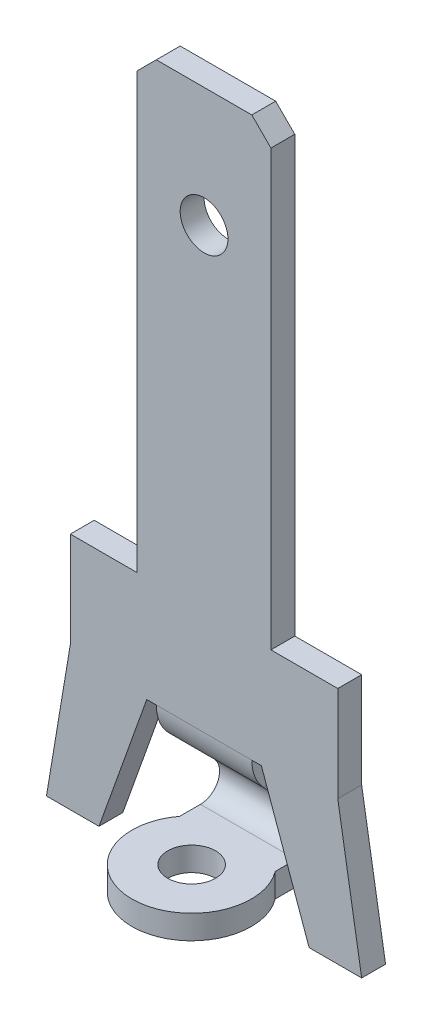
ISO-10303-21;
HEADER;
FILE_DESCRIPTION(('STEP AP214'),'2;1');
FILE_NAME('part.step','',(''),(''),'','','');
FILE_SCHEMA(('AUTOMOTIVE_DESIGN { 1 0 10303 214 1 1 1 1 }'));
ENDSEC;
DATA;
#1=APPLICATION_CONTEXT('core data for automotive mechanical design processes');
#2=APPLICATION_PROTOCOL_DEFINITION('international standard','automotive_design',2000,#1);
#3=PRODUCT_CONTEXT('',#1,'mechanical');
#4=PRODUCT('Part','Part','',(#3));
#5=PRODUCT_RELATED_PRODUCT_CATEGORY('part','',(#4));
#6=PRODUCT_DEFINITION_FORMATION('','',#4);
#7=PRODUCT_DEFINITION_CONTEXT('part definition',#1,'design');
#8=PRODUCT_DEFINITION('design','',#6,#7);
#9=PRODUCT_DEFINITION_SHAPE('','',#8);
#10=(LENGTH_UNIT() NAMED_UNIT(*) SI_UNIT(.MILLI.,.METRE.));
#11=(NAMED_UNIT(*) PLANE_ANGLE_UNIT() SI_UNIT($,.RADIAN.));
#12=(NAMED_UNIT(*) SI_UNIT($,.STERADIAN.) SOLID_ANGLE_UNIT());
#13=UNCERTAINTY_MEASURE_WITH_UNIT(LENGTH_MEASURE(1.E-05),#10,'distance_accuracy_value','');
#14=(GEOMETRIC_REPRESENTATION_CONTEXT(3) GLOBAL_UNCERTAINTY_ASSIGNED_CONTEXT((#13)) GLOBAL_UNIT_ASSIGNED_CONTEXT((#10,
#11,#12)) REPRESENTATION_CONTEXT('',''));
#15=CARTESIAN_POINT('',(0.,0.,0.));
#16=DIRECTION('',(0.,0.,1.));
#17=DIRECTION('',(1.,0.,0.));
#18=AXIS2_PLACEMENT_3D('',#15,#16,#17);
#19=CARTESIAN_POINT('',(1.2,-2.2,0.25));
#20=DIRECTION('',(0.,-1.,0.));
#21=DIRECTION('',(-1.,0.,0.));
#22=AXIS2_PLACEMENT_3D('',#19,#20,#21);
#23=PLANE('',#22);
#24=DIRECTION('',(-1.,0.,0.));
#25=VECTOR('',#24,1.);
#26=CARTESIAN_POINT('',(-1.4,-2.2,-0.25));
#27=LINE('',#26,#25);
#28=CARTESIAN_POINT('',(-1.,-2.2,-0.249999999999999));
#29=VERTEX_POINT('',#28);
#30=CARTESIAN_POINT('',(-1.2,-2.2,-0.25));
#31=VERTEX_POINT('',#30);
#32=EDGE_CURVE('E461',#29,#31,#27,.T.);
#33=ORIENTED_EDGE('',*,*,#32,.F.);
#34=DIRECTION('',(0.,0.,1.));
#35=VECTOR('',#34,1.);
#36=CARTESIAN_POINT('',(-1.,-2.2,-0.249999999999999));
#37=LINE('',#36,#35);
#38=CARTESIAN_POINT('',(-1.,-2.2,0.25));
#39=VERTEX_POINT('',#38);
#40=EDGE_CURVE('E375',#29,#39,#37,.T.);
#41=ORIENTED_EDGE('',*,*,#40,.T.);
#42=DIRECTION('',(-1.,0.,0.));
#43=VECTOR('',#42,1.);
#44=CARTESIAN_POINT('',(1.2,-2.2,0.25));
#45=LINE('',#44,#43);
#46=CARTESIAN_POINT('',(-1.2,-2.2,0.25));
#47=VERTEX_POINT('',#46);
#48=EDGE_CURVE('E410',#39,#47,#45,.T.);
#49=ORIENTED_EDGE('',*,*,#48,.T.);
#50=DIRECTION('',(0.,0.,1.));
#51=VECTOR('',#50,1.);
#52=CARTESIAN_POINT('',(-1.2,-2.2,0.25));
#53=LINE('',#52,#51);
#54=EDGE_CURVE('E489',#31,#47,#53,.T.);
#55=ORIENTED_EDGE('',*,*,#54,.F.);
#56=EDGE_LOOP('',(#33,#41,#49,#55));
#57=FACE_BOUND('',#56,.T.);
#58=ADVANCED_FACE('F84',(#57),#23,.T.);
#59=CARTESIAN_POINT('',(-2.8,0.,0.25));
#60=DIRECTION('',(1.,0.,0.));
#61=DIRECTION('',(0.,-1.,0.));
#62=AXIS2_PLACEMENT_3D('',#59,#60,#61);
#63=PLANE('',#62);
#64=DIRECTION('',(0.,0.,1.));
#65=VECTOR('',#64,1.);
#66=CARTESIAN_POINT('',(-2.8,0.,0.25));
#67=LINE('',#66,#65);
#68=CARTESIAN_POINT('',(-2.8,0.,-0.25));
#69=VERTEX_POINT('',#68);
#70=CARTESIAN_POINT('',(-2.8,0.,0.25));
#71=VERTEX_POINT('',#70);
#72=EDGE_CURVE('E498',#69,#71,#67,.T.);
#73=ORIENTED_EDGE('',*,*,#72,.F.);
#74=DIRECTION('',(0.,1.,0.));
#75=VECTOR('',#74,1.);
#76=CARTESIAN_POINT('',(-2.8,9.5,-0.25));
#77=LINE('',#76,#75);
#78=CARTESIAN_POINT('',(-2.8,-2.,-0.25));
#79=VERTEX_POINT('',#78);
#80=EDGE_CURVE('E471',#69,#79,#77,.F.);
#81=ORIENTED_EDGE('',*,*,#80,.T.);
#82=DIRECTION('',(0.,0.,1.));
#83=VECTOR('',#82,1.);
#84=CARTESIAN_POINT('',(-2.8,-2.,0.25));
#85=LINE('',#84,#83);
#86=CARTESIAN_POINT('',(-2.8,-2.,0.25));
#87=VERTEX_POINT('',#86);
#88=EDGE_CURVE('E496',#79,#87,#85,.T.);
#89=ORIENTED_EDGE('',*,*,#88,.T.);
#90=DIRECTION('',(0.,-1.,0.));
#91=VECTOR('',#90,1.);
#92=CARTESIAN_POINT('',(-2.8,0.,0.25));
#93=LINE('',#92,#91);
#94=EDGE_CURVE('E398',#71,#87,#93,.T.);
#95=ORIENTED_EDGE('',*,*,#94,.F.);
#96=EDGE_LOOP('',(#73,#81,#89,#95));
#97=FACE_BOUND('',#96,.T.);
#98=ADVANCED_FACE('F533',(#97),#63,.F.);
#99=CARTESIAN_POINT('',(-2.8,-2.,0.25));
#100=DIRECTION('',(0.986393923832144,-0.164398987305358,0.));
#101=DIRECTION('',(-0.164398987305358,-0.986393923832144,0.));
#102=AXIS2_PLACEMENT_3D('',#99,#100,#101);
#103=PLANE('',#102);
#104=ORIENTED_EDGE('',*,*,#88,.F.);
#105=DIRECTION('',(-0.164398987305358,-0.986393923832144,0.));
#106=VECTOR('',#105,1.);
#107=CARTESIAN_POINT('',(-2.8,-2.,-0.25));
#108=LINE('',#107,#106);
#109=CARTESIAN_POINT('',(-3.3,-5.,-0.25));
#110=VERTEX_POINT('',#109);
#111=EDGE_CURVE('E468',#79,#110,#108,.T.);
#112=ORIENTED_EDGE('',*,*,#111,.T.);
#113=DIRECTION('',(0.,0.,1.));
#114=VECTOR('',#113,1.);
#115=CARTESIAN_POINT('',(-3.3,-5.,0.25));
#116=LINE('',#115,#114);
#117=CARTESIAN_POINT('',(-3.3,-5.,0.25));
#118=VERTEX_POINT('',#117);
#119=EDGE_CURVE('E494',#110,#118,#116,.T.);
#120=ORIENTED_EDGE('',*,*,#119,.T.);
#121=DIRECTION('',(-0.164398987305358,-0.986393923832144,0.));
#122=VECTOR('',#121,1.);
#123=CARTESIAN_POINT('',(-2.8,-2.,0.25));
#124=LINE('',#123,#122);
#125=EDGE_CURVE('E401',#87,#118,#124,.T.);
#126=ORIENTED_EDGE('',*,*,#125,.F.);
#127=EDGE_LOOP('',(#104,#112,#120,#126));
#128=FACE_BOUND('',#127,.T.);
#129=ADVANCED_FACE('F537',(#128),#103,.F.);
#130=CARTESIAN_POINT('',(-3.3,-5.,0.25));
#131=DIRECTION('',(0.,1.,0.));
#132=DIRECTION('',(1.,0.,0.));
#133=AXIS2_PLACEMENT_3D('',#130,#131,#132);
#134=PLANE('',#133);
#135=ORIENTED_EDGE('',*,*,#119,.F.);
#136=DIRECTION('',(-1.,0.,0.));
#137=VECTOR('',#136,1.);
#138=CARTESIAN_POINT('',(-1.4,-5.,-0.25));
#139=LINE('',#138,#137);
#140=CARTESIAN_POINT('',(-2.2,-5.,-0.25));
#141=VERTEX_POINT('',#140);
#142=EDGE_CURVE('E465',#110,#141,#139,.F.);
#143=ORIENTED_EDGE('',*,*,#142,.T.);
#144=DIRECTION('',(0.,0.,1.));
#145=VECTOR('',#144,1.);
#146=CARTESIAN_POINT('',(-2.2,-5.,0.25));
#147=LINE('',#146,#145);
#148=CARTESIAN_POINT('',(-2.2,-5.,0.25));
#149=VERTEX_POINT('',#148);
#150=EDGE_CURVE('E492',#141,#149,#147,.T.);
#151=ORIENTED_EDGE('',*,*,#150,.T.);
#152=DIRECTION('',(1.,0.,0.));
#153=VECTOR('',#152,1.);
#154=CARTESIAN_POINT('',(-3.3,-5.,0.25));
#155=LINE('',#154,#153);
#156=EDGE_CURVE('E404',#118,#149,#155,.T.);
#157=ORIENTED_EDGE('',*,*,#156,.F.);
#158=EDGE_LOOP('',(#135,#143,#151,#157));
#159=FACE_BOUND('',#158,.T.);
#160=ADVANCED_FACE('F541',(#159),#134,.F.);
#161=CARTESIAN_POINT('',(-2.2,-5.,0.25));
#162=DIRECTION('',(-0.941741911594837,0.336336396998157,0.));
#163=DIRECTION('',(0.336336396998157,0.941741911594837,0.));
#164=AXIS2_PLACEMENT_3D('',#161,#162,#163);
#165=PLANE('',#164);
#166=ORIENTED_EDGE('',*,*,#150,.F.);
#167=DIRECTION('',(0.336336396998157,0.941741911594837,0.));
#168=VECTOR('',#167,1.);
#169=CARTESIAN_POINT('',(-2.2,-5.,-0.25));
#170=LINE('',#169,#168);
#171=EDGE_CURVE('E462',#141,#31,#170,.T.);
#172=ORIENTED_EDGE('',*,*,#171,.T.);
#173=ORIENTED_EDGE('',*,*,#54,.T.);
#174=DIRECTION('',(0.336336396998157,0.941741911594837,0.));
#175=VECTOR('',#174,1.);
#176=CARTESIAN_POINT('',(-2.2,-5.,0.25));
#177=LINE('',#176,#175);
#178=EDGE_CURVE('E407',#149,#47,#177,.T.);
#179=ORIENTED_EDGE('',*,*,#178,.F.);
#180=EDGE_LOOP('',(#166,#172,#173,#179));
#181=FACE_BOUND('',#180,.T.);
#182=ADVANCED_FACE('F546',(#181),#165,.F.);
#183=DIRECTION('',(0.,0.,1.));
#184=VECTOR('',#183,1.);
#185=CARTESIAN_POINT('',(1.,-2.2,-0.25));
#186=LINE('',#185,#184);
#187=CARTESIAN_POINT('',(1.,-2.2,-0.25));
#188=VERTEX_POINT('',#187);
#189=CARTESIAN_POINT('',(1.,-2.2,0.25));
#190=VERTEX_POINT('',#189);
#191=EDGE_CURVE('E384',#188,#190,#186,.T.);
#192=ORIENTED_EDGE('',*,*,#191,.F.);
#193=CARTESIAN_POINT('',(1.2,-2.2,-0.25));
#194=VERTEX_POINT('',#193);
#195=EDGE_CURVE('E458',#194,#188,#27,.T.);
#196=ORIENTED_EDGE('',*,*,#195,.F.);
#197=DIRECTION('',(0.,0.,1.));
#198=VECTOR('',#197,1.);
#199=CARTESIAN_POINT('',(1.2,-2.2,0.25));
#200=LINE('',#199,#198);
#201=CARTESIAN_POINT('',(1.2,-2.2,0.25));
#202=VERTEX_POINT('',#201);
#203=EDGE_CURVE('E487',#194,#202,#200,.T.);
#204=ORIENTED_EDGE('',*,*,#203,.T.);
#205=EDGE_CURVE('E411',#202,#190,#45,.T.);
#206=ORIENTED_EDGE('',*,*,#205,.T.);
#207=EDGE_LOOP('',(#192,#196,#204,#206));
#208=FACE_BOUND('',#207,.T.);
#209=ADVANCED_FACE('F558',(#208),#23,.T.);
#210=CARTESIAN_POINT('',(2.2,-5.,0.25));
#211=DIRECTION('',(-0.941741911594837,-0.336336396998157,0.));
#212=DIRECTION('',(-0.336336396998157,0.941741911594837,0.));
#213=AXIS2_PLACEMENT_3D('',#210,#211,#212);
#214=PLANE('',#213);
#215=ORIENTED_EDGE('',*,*,#203,.F.);
#216=DIRECTION('',(-0.336336396998157,0.941741911594837,0.));
#217=VECTOR('',#216,1.);
#218=CARTESIAN_POINT('',(2.2,-5.,-0.25));
#219=LINE('',#218,#217);
#220=CARTESIAN_POINT('',(2.2,-5.,-0.25));
#221=VERTEX_POINT('',#220);
#222=EDGE_CURVE('E455',#221,#194,#219,.T.);
#223=ORIENTED_EDGE('',*,*,#222,.F.);
#224=DIRECTION('',(0.,0.,1.));
#225=VECTOR('',#224,1.);
#226=CARTESIAN_POINT('',(2.2,-5.,0.25));
#227=LINE('',#226,#225);
#228=CARTESIAN_POINT('',(2.2,-5.,0.25));
#229=VERTEX_POINT('',#228);
#230=EDGE_CURVE('E485',#221,#229,#227,.T.);
#231=ORIENTED_EDGE('',*,*,#230,.T.);
#232=DIRECTION('',(-0.336336396998157,0.941741911594837,0.));
#233=VECTOR('',#232,1.);
#234=CARTESIAN_POINT('',(2.2,-5.,0.25));
#235=LINE('',#234,#233);
#236=EDGE_CURVE('E414',#229,#202,#235,.T.);
#237=ORIENTED_EDGE('',*,*,#236,.T.);
#238=EDGE_LOOP('',(#215,#223,#231,#237));
#239=FACE_BOUND('',#238,.T.);
#240=ADVANCED_FACE('F562',(#239),#214,.T.);
#241=CARTESIAN_POINT('',(3.3,-5.,0.25));
#242=DIRECTION('',(0.,-1.,0.));
#243=DIRECTION('',(-1.,0.,0.));
#244=AXIS2_PLACEMENT_3D('',#241,#242,#243);
#245=PLANE('',#244);
#246=ORIENTED_EDGE('',*,*,#230,.F.);
#247=DIRECTION('',(-1.,0.,0.));
#248=VECTOR('',#247,1.);
#249=CARTESIAN_POINT('',(-1.4,-5.,-0.25));
#250=LINE('',#249,#248);
#251=CARTESIAN_POINT('',(3.3,-5.,-0.25));
#252=VERTEX_POINT('',#251);
#253=EDGE_CURVE('E452',#252,#221,#250,.T.);
#254=ORIENTED_EDGE('',*,*,#253,.F.);
#255=DIRECTION('',(0.,0.,1.));
#256=VECTOR('',#255,1.);
#257=CARTESIAN_POINT('',(3.3,-5.,0.25));
#258=LINE('',#257,#256);
#259=CARTESIAN_POINT('',(3.3,-5.,0.25));
#260=VERTEX_POINT('',#259);
#261=EDGE_CURVE('E483',#252,#260,#258,.T.);
#262=ORIENTED_EDGE('',*,*,#261,.T.);
#263=DIRECTION('',(-1.,0.,0.));
#264=VECTOR('',#263,1.);
#265=CARTESIAN_POINT('',(3.3,-5.,0.25));
#266=LINE('',#265,#264);
#267=EDGE_CURVE('E417',#260,#229,#266,.T.);
#268=ORIENTED_EDGE('',*,*,#267,.T.);
#269=EDGE_LOOP('',(#246,#254,#262,#268));
#270=FACE_BOUND('',#269,.T.);
#271=ADVANCED_FACE('F566',(#270),#245,.T.);
#272=CARTESIAN_POINT('',(2.8,-2.,0.25));
#273=DIRECTION('',(0.986393923832144,0.164398987305358,0.));
#274=DIRECTION('',(0.164398987305358,-0.986393923832144,0.));
#275=AXIS2_PLACEMENT_3D('',#272,#273,#274);
#276=PLANE('',#275);
#277=ORIENTED_EDGE('',*,*,#261,.F.);
#278=DIRECTION('',(0.164398987305358,-0.986393923832144,0.));
#279=VECTOR('',#278,1.);
#280=CARTESIAN_POINT('',(2.8,-2.,-0.25));
#281=LINE('',#280,#279);
#282=CARTESIAN_POINT('',(2.8,-2.,-0.25));
#283=VERTEX_POINT('',#282);
#284=EDGE_CURVE('E449',#283,#252,#281,.T.);
#285=ORIENTED_EDGE('',*,*,#284,.F.);
#286=DIRECTION('',(0.,0.,1.));
#287=VECTOR('',#286,1.);
#288=CARTESIAN_POINT('',(2.8,-2.,0.25));
#289=LINE('',#288,#287);
#290=CARTESIAN_POINT('',(2.8,-2.,0.25));
#291=VERTEX_POINT('',#290);
#292=EDGE_CURVE('E481',#283,#291,#289,.T.);
#293=ORIENTED_EDGE('',*,*,#292,.T.);
#294=DIRECTION('',(0.164398987305358,-0.986393923832144,0.));
#295=VECTOR('',#294,1.);
#296=CARTESIAN_POINT('',(2.8,-2.,0.25));
#297=LINE('',#296,#295);
#298=EDGE_CURVE('E420',#291,#260,#297,.T.);
#299=ORIENTED_EDGE('',*,*,#298,.T.);
#300=EDGE_LOOP('',(#277,#285,#293,#299));
#301=FACE_BOUND('',#300,.T.);
#302=ADVANCED_FACE('F571',(#301),#276,.T.);
#303=CARTESIAN_POINT('',(2.8,0.,0.25));
#304=DIRECTION('',(1.,0.,0.));
#305=DIRECTION('',(0.,-1.,0.));
#306=AXIS2_PLACEMENT_3D('',#303,#304,#305);
#307=PLANE('',#306);
#308=ORIENTED_EDGE('',*,*,#292,.F.);
#309=DIRECTION('',(0.,1.,0.));
#310=VECTOR('',#309,1.);
#311=CARTESIAN_POINT('',(2.8,9.5,-0.25));
#312=LINE('',#311,#310);
#313=CARTESIAN_POINT('',(2.8,0.,-0.25));
#314=VERTEX_POINT('',#313);
#315=EDGE_CURVE('E446',#314,#283,#312,.F.);
#316=ORIENTED_EDGE('',*,*,#315,.F.);
#317=DIRECTION('',(0.,0.,1.));
#318=VECTOR('',#317,1.);
#319=CARTESIAN_POINT('',(2.8,0.,0.25));
#320=LINE('',#319,#318);
#321=CARTESIAN_POINT('',(2.8,0.,0.25));
#322=VERTEX_POINT('',#321);
#323=EDGE_CURVE('E479',#314,#322,#320,.T.);
#324=ORIENTED_EDGE('',*,*,#323,.T.);
#325=DIRECTION('',(0.,-1.,0.));
#326=VECTOR('',#325,1.);
#327=CARTESIAN_POINT('',(2.8,0.,0.25));
#328=LINE('',#327,#326);
#329=EDGE_CURVE('E423',#322,#291,#328,.T.);
#330=ORIENTED_EDGE('',*,*,#329,.T.);
#331=EDGE_LOOP('',(#308,#316,#324,#330));
#332=FACE_BOUND('',#331,.T.);
#333=ADVANCED_FACE('F574',(#332),#307,.T.);
#334=CARTESIAN_POINT('',(0.,0.,0.25));
#335=DIRECTION('',(0.,1.,0.));
#336=DIRECTION('',(1.,0.,0.));
#337=AXIS2_PLACEMENT_3D('',#334,#335,#336);
#338=PLANE('',#337);
#339=ORIENTED_EDGE('',*,*,#323,.F.);
#340=DIRECTION('',(-1.,0.,0.));
#341=VECTOR('',#340,1.);
#342=CARTESIAN_POINT('',(-1.4,0.,-0.25));
#343=LINE('',#342,#341);
#344=CARTESIAN_POINT('',(1.4,0.,-0.25));
#345=VERTEX_POINT('',#344);
#346=EDGE_CURVE('E443',#345,#314,#343,.F.);
#347=ORIENTED_EDGE('',*,*,#346,.F.);
#348=DIRECTION('',(0.,0.,1.));
#349=VECTOR('',#348,1.);
#350=CARTESIAN_POINT('',(1.4,0.,0.25));
#351=LINE('',#350,#349);
#352=CARTESIAN_POINT('',(1.4,0.,0.25));
#353=VERTEX_POINT('',#352);
#354=EDGE_CURVE('E476',#345,#353,#351,.T.);
#355=ORIENTED_EDGE('',*,*,#354,.T.);
#356=DIRECTION('',(1.,0.,0.));
#357=VECTOR('',#356,1.);
#358=CARTESIAN_POINT('',(0.,0.,0.25));
#359=LINE('',#358,#357);
#360=EDGE_CURVE('E426',#353,#322,#359,.T.);
#361=ORIENTED_EDGE('',*,*,#360,.T.);
#362=EDGE_LOOP('',(#339,#347,#355,#361));
#363=FACE_BOUND('',#362,.T.);
#364=ADVANCED_FACE('F578',(#363),#338,.T.);
#365=CARTESIAN_POINT('',(1.4,9.5,0.25));
#366=DIRECTION('',(1.,0.,0.));
#367=DIRECTION('',(0.,-1.,0.));
#368=AXIS2_PLACEMENT_3D('',#365,#366,#367);
#369=PLANE('',#368);
#370=DIRECTION('',(0.,1.,0.));
#371=VECTOR('',#370,1.);
#372=CARTESIAN_POINT('',(1.4,9.5,-0.25));
#373=LINE('',#372,#371);
#374=CARTESIAN_POINT('',(1.4,9.1,-0.25));
#375=VERTEX_POINT('',#374);
#376=EDGE_CURVE('E441',#375,#345,#373,.F.);
#377=ORIENTED_EDGE('',*,*,#376,.F.);
#378=DIRECTION('',(0.,0.,1.));
#379=VECTOR('',#378,1.);
#380=CARTESIAN_POINT('',(1.4,9.1,0.25));
#381=LINE('',#380,#379);
#382=CARTESIAN_POINT('',(1.4,9.1,0.25));
#383=VERTEX_POINT('',#382);
#384=EDGE_CURVE('E13',#375,#383,#381,.T.);
#385=ORIENTED_EDGE('',*,*,#384,.T.);
#386=DIRECTION('',(0.,-1.,0.));
#387=VECTOR('',#386,1.);
#388=CARTESIAN_POINT('',(1.4,9.5,0.25));
#389=LINE('',#388,#387);
#390=EDGE_CURVE('E429',#383,#353,#389,.T.);
#391=ORIENTED_EDGE('',*,*,#390,.T.);
#392=ORIENTED_EDGE('',*,*,#354,.F.);
#393=EDGE_LOOP('',(#377,#385,#391,#392));
#394=FACE_BOUND('',#393,.T.);
#395=ADVANCED_FACE('F582',(#394),#369,.T.);
#396=CARTESIAN_POINT('',(-1.4,9.5,0.25));
#397=DIRECTION('',(0.,1.,0.));
#398=DIRECTION('',(1.,0.,0.));
#399=AXIS2_PLACEMENT_3D('',#396,#397,#398);
#400=PLANE('',#399);
#401=DIRECTION('',(-1.,0.,0.));
#402=VECTOR('',#401,1.);
#403=CARTESIAN_POINT('',(-1.4,9.5,-0.25));
#404=LINE('',#403,#402);
#405=CARTESIAN_POINT('',(-1.,9.5,-0.25));
#406=VERTEX_POINT('',#405);
#407=CARTESIAN_POINT('',(0.999999999999997,9.5,-0.25));
#408=VERTEX_POINT('',#407);
#409=EDGE_CURVE('E393',#406,#408,#404,.F.);
#410=ORIENTED_EDGE('',*,*,#409,.F.);
#411=DIRECTION('',(0.,0.,1.));
#412=VECTOR('',#411,1.);
#413=CARTESIAN_POINT('',(-1.,9.5,0.25));
#414=LINE('',#413,#412);
#415=CARTESIAN_POINT('',(-1.,9.5,0.25));
#416=VERTEX_POINT('',#415);
#417=EDGE_CURVE('E504',#406,#416,#414,.T.);
#418=ORIENTED_EDGE('',*,*,#417,.T.);
#419=DIRECTION('',(1.,0.,0.));
#420=VECTOR('',#419,1.);
#421=CARTESIAN_POINT('',(-1.4,9.5,0.25));
#422=LINE('',#421,#420);
#423=CARTESIAN_POINT('',(0.999999999999997,9.5,0.25));
#424=VERTEX_POINT('',#423);
#425=EDGE_CURVE('E431',#416,#424,#422,.T.);
#426=ORIENTED_EDGE('',*,*,#425,.T.);
#427=DIRECTION('',(0.,0.,-1.));
#428=VECTOR('',#427,1.);
#429=CARTESIAN_POINT('',(0.999999999999997,9.5,0.25));
#430=LINE('',#429,#428);
#431=EDGE_CURVE('E500',#424,#408,#430,.T.);
#432=ORIENTED_EDGE('',*,*,#431,.T.);
#433=EDGE_LOOP('',(#410,#418,#426,#432));
#434=FACE_BOUND('',#433,.T.);
#435=ADVANCED_FACE('F519',(#434),#400,.T.);
#436=CARTESIAN_POINT('',(-1.4,9.5,0.25));
#437=DIRECTION('',(1.,0.,0.));
#438=DIRECTION('',(0.,-1.,0.));
#439=AXIS2_PLACEMENT_3D('',#436,#437,#438);
#440=PLANE('',#439);
#441=DIRECTION('',(0.,-1.,0.));
#442=VECTOR('',#441,1.);
#443=CARTESIAN_POINT('',(-1.4,9.5,0.25));
#444=LINE('',#443,#442);
#445=CARTESIAN_POINT('',(-1.4,9.1,0.25));
#446=VERTEX_POINT('',#445);
#447=CARTESIAN_POINT('',(-1.4,0.,0.25));
#448=VERTEX_POINT('',#447);
#449=EDGE_CURVE('E392',#446,#448,#444,.T.);
#450=ORIENTED_EDGE('',*,*,#449,.F.);
#451=DIRECTION('',(0.,0.,1.));
#452=VECTOR('',#451,1.);
#453=CARTESIAN_POINT('',(-1.4,9.1,0.25));
#454=LINE('',#453,#452);
#455=CARTESIAN_POINT('',(-1.4,9.1,-0.25));
#456=VERTEX_POINT('',#455);
#457=EDGE_CURVE('E107',#446,#456,#454,.F.);
#458=ORIENTED_EDGE('',*,*,#457,.T.);
#459=DIRECTION('',(0.,1.,0.));
#460=VECTOR('',#459,1.);
#461=CARTESIAN_POINT('',(-1.4,9.5,-0.25));
#462=LINE('',#461,#460);
#463=CARTESIAN_POINT('',(-1.4,0.,-0.25));
#464=VERTEX_POINT('',#463);
#465=EDGE_CURVE('E437',#456,#464,#462,.F.);
#466=ORIENTED_EDGE('',*,*,#465,.T.);
#467=DIRECTION('',(0.,0.,1.));
#468=VECTOR('',#467,1.);
#469=CARTESIAN_POINT('',(-1.4,0.,0.25));
#470=LINE('',#469,#468);
#471=EDGE_CURVE('E434',#464,#448,#470,.T.);
#472=ORIENTED_EDGE('',*,*,#471,.T.);
#473=EDGE_LOOP('',(#450,#458,#466,#472));
#474=FACE_BOUND('',#473,.T.);
#475=ADVANCED_FACE('F525',(#474),#440,.F.);
#476=CARTESIAN_POINT('',(0.,7.,0.25));
#477=DIRECTION('',(0.,0.,1.));
#478=DIRECTION('',(1.,0.,0.));
#479=AXIS2_PLACEMENT_3D('',#476,#477,#478);
#480=CYLINDRICAL_SURFACE('',#479,0.5);
#481=CARTESIAN_POINT('',(0.,7.,0.25));
#482=DIRECTION('',(0.,0.,1.));
#483=DIRECTION('',(1.,0.,0.));
#484=AXIS2_PLACEMENT_3D('',#481,#482,#483);
#485=CIRCLE('',#484,0.5);
#486=CARTESIAN_POINT('',(0.500000000000001,7.,0.25));
#487=VERTEX_POINT('',#486);
#488=EDGE_CURVE('E389',#487,#487,#485,.T.);
#489=ORIENTED_EDGE('',*,*,#488,.T.);
#490=EDGE_LOOP('',(#489));
#491=FACE_BOUND('',#490,.T.);
#492=CARTESIAN_POINT('',(0.,7.,-0.25));
#493=DIRECTION('',(0.,0.,1.));
#494=DIRECTION('',(1.,0.,0.));
#495=AXIS2_PLACEMENT_3D('',#492,#493,#494);
#496=CIRCLE('',#495,0.5);
#497=CARTESIAN_POINT('',(0.500000000000001,7.,-0.25));
#498=VERTEX_POINT('',#497);
#499=EDGE_CURVE('E386',#498,#498,#496,.T.);
#500=ORIENTED_EDGE('',*,*,#499,.F.);
#501=EDGE_LOOP('',(#500));
#502=FACE_BOUND('',#501,.T.);
#503=ADVANCED_FACE('F611',(#491,#502),#480,.F.);
#504=CARTESIAN_POINT('',(0.,0.,0.25));
#505=DIRECTION('',(0.,-1.,0.));
#506=DIRECTION('',(-1.,0.,0.));
#507=AXIS2_PLACEMENT_3D('',#504,#505,#506);
#508=PLANE('',#507);
#509=DIRECTION('',(-1.,0.,0.));
#510=VECTOR('',#509,1.);
#511=CARTESIAN_POINT('',(-1.4,0.,-0.25));
#512=LINE('',#511,#510);
#513=EDGE_CURVE('E439',#464,#69,#512,.T.);
#514=ORIENTED_EDGE('',*,*,#513,.T.);
#515=ORIENTED_EDGE('',*,*,#72,.T.);
#516=DIRECTION('',(-1.,0.,0.));
#517=VECTOR('',#516,1.);
#518=CARTESIAN_POINT('',(0.,0.,0.25));
#519=LINE('',#518,#517);
#520=EDGE_CURVE('E395',#448,#71,#519,.T.);
#521=ORIENTED_EDGE('',*,*,#520,.F.);
#522=ORIENTED_EDGE('',*,*,#471,.F.);
#523=EDGE_LOOP('',(#514,#515,#521,#522));
#524=FACE_BOUND('',#523,.T.);
#525=ADVANCED_FACE('F529',(#524),#508,.F.);
#526=CARTESIAN_POINT('',(-1.4,9.5,0.25));
#527=DIRECTION('',(0.,0.,-1.));
#528=DIRECTION('',(-1.,0.,0.));
#529=AXIS2_PLACEMENT_3D('',#526,#527,#528);
#530=PLANE('',#529);
#531=ORIENTED_EDGE('',*,*,#488,.F.);
#532=EDGE_LOOP('',(#531));
#533=FACE_BOUND('',#532,.T.);
#534=ORIENTED_EDGE('',*,*,#425,.F.);
#535=DIRECTION('',(-0.707106781186546,-0.707106781186549,0.));
#536=VECTOR('',#535,1.);
#537=CARTESIAN_POINT('',(-1.,9.5,0.25));
#538=LINE('',#537,#536);
#539=EDGE_CURVE('E509',#416,#446,#538,.T.);
#540=ORIENTED_EDGE('',*,*,#539,.T.);
#541=ORIENTED_EDGE('',*,*,#449,.T.);
#542=ORIENTED_EDGE('',*,*,#520,.T.);
#543=ORIENTED_EDGE('',*,*,#94,.T.);
#544=ORIENTED_EDGE('',*,*,#125,.T.);
#545=ORIENTED_EDGE('',*,*,#156,.T.);
#546=ORIENTED_EDGE('',*,*,#178,.T.);
#547=ORIENTED_EDGE('',*,*,#48,.F.);
#548=DIRECTION('',(-1.,0.,0.));
#549=VECTOR('',#548,1.);
#550=CARTESIAN_POINT('',(-1.,-2.2,0.250000000000001));
#551=LINE('',#550,#549);
#552=EDGE_CURVE('E368',#39,#190,#551,.F.);
#553=ORIENTED_EDGE('',*,*,#552,.T.);
#554=ORIENTED_EDGE('',*,*,#205,.F.);
#555=ORIENTED_EDGE('',*,*,#236,.F.);
#556=ORIENTED_EDGE('',*,*,#267,.F.);
#557=ORIENTED_EDGE('',*,*,#298,.F.);
#558=ORIENTED_EDGE('',*,*,#329,.F.);
#559=ORIENTED_EDGE('',*,*,#360,.F.);
#560=ORIENTED_EDGE('',*,*,#390,.F.);
#561=DIRECTION('',(0.707106781186551,-0.707106781186544,0.));
#562=VECTOR('',#561,1.);
#563=CARTESIAN_POINT('',(1.4,9.1,0.25));
#564=LINE('',#563,#562);
#565=EDGE_CURVE('E507',#383,#424,#564,.F.);
#566=ORIENTED_EDGE('',*,*,#565,.T.);
#567=EDGE_LOOP('',(#534,#540,#541,#542,#543,#544,#545,#546,#547,#553,#554,#555,#556,#557,#558,
#559,#560,#566));
#568=FACE_BOUND('',#567,.T.);
#569=ADVANCED_FACE('F524',(#533,#568),#530,.F.);
#570=CARTESIAN_POINT('',(-1.4,9.5,-0.25));
#571=DIRECTION('',(0.,0.,-1.));
#572=DIRECTION('',(-1.,0.,0.));
#573=AXIS2_PLACEMENT_3D('',#570,#571,#572);
#574=PLANE('',#573);
#575=ORIENTED_EDGE('',*,*,#499,.T.);
#576=EDGE_LOOP('',(#575));
#577=FACE_BOUND('',#576,.T.);
#578=ORIENTED_EDGE('',*,*,#465,.F.);
#579=DIRECTION('',(0.707106781186546,0.707106781186549,0.));
#580=VECTOR('',#579,1.);
#581=CARTESIAN_POINT('',(-1.2,9.3,-0.25));
#582=LINE('',#581,#580);
#583=EDGE_CURVE('E92',#456,#406,#582,.T.);
#584=ORIENTED_EDGE('',*,*,#583,.T.);
#585=ORIENTED_EDGE('',*,*,#409,.T.);
#586=DIRECTION('',(-0.707106781186551,0.707106781186544,0.));
#587=VECTOR('',#586,1.);
#588=CARTESIAN_POINT('',(-0.200000000000012,10.7,-0.25));
#589=LINE('',#588,#587);
#590=EDGE_CURVE('E99',#408,#375,#589,.F.);
#591=ORIENTED_EDGE('',*,*,#590,.T.);
#592=ORIENTED_EDGE('',*,*,#376,.T.);
#593=ORIENTED_EDGE('',*,*,#346,.T.);
#594=ORIENTED_EDGE('',*,*,#315,.T.);
#595=ORIENTED_EDGE('',*,*,#284,.T.);
#596=ORIENTED_EDGE('',*,*,#253,.T.);
#597=ORIENTED_EDGE('',*,*,#222,.T.);
#598=ORIENTED_EDGE('',*,*,#195,.T.);
#599=DIRECTION('',(-1.,0.,0.));
#600=VECTOR('',#599,1.);
#601=CARTESIAN_POINT('',(-1.,-2.2,-0.249999999999999));
#602=LINE('',#601,#600);
#603=EDGE_CURVE('E380',#29,#188,#602,.F.);
#604=ORIENTED_EDGE('',*,*,#603,.F.);
#605=ORIENTED_EDGE('',*,*,#32,.T.);
#606=ORIENTED_EDGE('',*,*,#171,.F.);
#607=ORIENTED_EDGE('',*,*,#142,.F.);
#608=ORIENTED_EDGE('',*,*,#111,.F.);
#609=ORIENTED_EDGE('',*,*,#80,.F.);
#610=ORIENTED_EDGE('',*,*,#513,.F.);
#611=EDGE_LOOP('',(#578,#584,#585,#591,#592,#593,#594,#595,#596,#597,#598,#604,#605,#606,#607,
#608,#609,#610));
#612=FACE_BOUND('',#611,.T.);
#613=ADVANCED_FACE('F514',(#577,#612),#574,.T.);
#614=CARTESIAN_POINT('',(1.,-2.2,-0.650000000000001));
#615=DIRECTION('',(1.,0.,0.));
#616=DIRECTION('',(0.,0.,-1.));
#617=AXIS2_PLACEMENT_3D('',#614,#615,#616);
#618=PLANE('',#617);
#619=DIRECTION('',(0.,-0.707106781186544,0.707106781186551));
#620=VECTOR('',#619,1.);
#621=CARTESIAN_POINT('',(1.,-2.83639610306789,-0.0136038969321037));
#622=LINE('',#621,#620);
#623=CARTESIAN_POINT('',(1.,-2.48284271247462,-0.36715728752538));
#624=VERTEX_POINT('',#623);
#625=CARTESIAN_POINT('',(1.,-2.83639610306789,-0.0136038969321038));
#626=VERTEX_POINT('',#625);
#627=EDGE_CURVE('E322',#624,#626,#622,.T.);
#628=ORIENTED_EDGE('',*,*,#627,.F.);
#629=CARTESIAN_POINT('',(1.,-2.2,-0.650000000000001));
#630=DIRECTION('',(-1.,0.,0.));
#631=DIRECTION('',(0.,0.,1.));
#632=AXIS2_PLACEMENT_3D('',#629,#630,#631);
#633=CIRCLE('',#632,0.400000000000001);
#634=EDGE_CURVE('E377',#188,#624,#633,.F.);
#635=ORIENTED_EDGE('',*,*,#634,.F.);
#636=ORIENTED_EDGE('',*,*,#191,.T.);
#637=CARTESIAN_POINT('',(1.,-2.2,-0.650000000000001));
#638=DIRECTION('',(-1.,0.,0.));
#639=DIRECTION('',(0.,0.,1.));
#640=AXIS2_PLACEMENT_3D('',#637,#638,#639);
#641=CIRCLE('',#640,0.900000000000001);
#642=EDGE_CURVE('E371',#190,#626,#641,.F.);
#643=ORIENTED_EDGE('',*,*,#642,.T.);
#644=EDGE_LOOP('',(#628,#635,#636,#643));
#645=FACE_BOUND('',#644,.T.);
#646=ADVANCED_FACE('F686',(#645),#618,.T.);
#647=CARTESIAN_POINT('',(-1.,-2.2,-0.65));
#648=DIRECTION('',(1.,0.,0.));
#649=DIRECTION('',(0.,0.,-1.));
#650=AXIS2_PLACEMENT_3D('',#647,#648,#649);
#651=PLANE('',#650);
#652=CARTESIAN_POINT('',(-1.,-2.2,-0.65));
#653=DIRECTION('',(-1.,0.,0.));
#654=DIRECTION('',(0.,0.,1.));
#655=AXIS2_PLACEMENT_3D('',#652,#653,#654);
#656=CIRCLE('',#655,0.400000000000001);
#657=CARTESIAN_POINT('',(-1.,-2.48284271247462,-0.367157287525379));
#658=VERTEX_POINT('',#657);
#659=EDGE_CURVE('E337',#658,#29,#656,.T.);
#660=ORIENTED_EDGE('',*,*,#659,.F.);
#661=DIRECTION('',(0.,-0.707106781186544,0.707106781186551));
#662=VECTOR('',#661,1.);
#663=CARTESIAN_POINT('',(-1.,-2.48284271247462,-0.36715728752538));
#664=LINE('',#663,#662);
#665=CARTESIAN_POINT('',(-1.,-2.83639610306789,-0.0136038969321037));
#666=VERTEX_POINT('',#665);
#667=EDGE_CURVE('E361',#658,#666,#664,.T.);
#668=ORIENTED_EDGE('',*,*,#667,.T.);
#669=CARTESIAN_POINT('',(-1.,-2.2,-0.65));
#670=DIRECTION('',(-1.,0.,0.));
#671=DIRECTION('',(0.,0.,1.));
#672=AXIS2_PLACEMENT_3D('',#669,#670,#671);
#673=CIRCLE('',#672,0.900000000000001);
#674=EDGE_CURVE('E372',#666,#39,#673,.T.);
#675=ORIENTED_EDGE('',*,*,#674,.T.);
#676=ORIENTED_EDGE('',*,*,#40,.F.);
#677=EDGE_LOOP('',(#660,#668,#675,#676));
#678=FACE_BOUND('',#677,.T.);
#679=ADVANCED_FACE('F818',(#678),#651,.F.);
#680=CARTESIAN_POINT('',(-1.,-2.2,-0.65));
#681=DIRECTION('',(-1.,0.,0.));
#682=DIRECTION('',(0.,-0.707106781186544,0.707106781186551));
#683=AXIS2_PLACEMENT_3D('',#680,#681,#682);
#684=CYLINDRICAL_SURFACE('',#683,0.900000000000001);
#685=ORIENTED_EDGE('',*,*,#552,.F.);
#686=ORIENTED_EDGE('',*,*,#674,.F.);
#687=DIRECTION('',(-1.,0.,0.));
#688=VECTOR('',#687,1.);
#689=CARTESIAN_POINT('',(0.,-2.83639610306789,-0.0136038969321037));
#690=LINE('',#689,#688);
#691=EDGE_CURVE('E358',#626,#666,#690,.T.);
#692=ORIENTED_EDGE('',*,*,#691,.F.);
#693=ORIENTED_EDGE('',*,*,#642,.F.);
#694=EDGE_LOOP('',(#685,#686,#692,#693));
#695=FACE_BOUND('',#694,.T.);
#696=ADVANCED_FACE('F810',(#695),#684,.T.);
#697=CARTESIAN_POINT('',(-1.,-2.2,-0.65));
#698=DIRECTION('',(-1.,0.,0.));
#699=DIRECTION('',(0.,-0.707106781186544,0.707106781186551));
#700=AXIS2_PLACEMENT_3D('',#697,#698,#699);
#701=CYLINDRICAL_SURFACE('',#700,0.400000000000001);
#702=ORIENTED_EDGE('',*,*,#603,.T.);
#703=ORIENTED_EDGE('',*,*,#634,.T.);
#704=DIRECTION('',(1.,0.,0.));
#705=VECTOR('',#704,1.);
#706=CARTESIAN_POINT('',(1.,-2.48284271247462,-0.36715728752538));
#707=LINE('',#706,#705);
#708=EDGE_CURVE('E364',#624,#658,#707,.F.);
#709=ORIENTED_EDGE('',*,*,#708,.T.);
#710=ORIENTED_EDGE('',*,*,#659,.T.);
#711=EDGE_LOOP('',(#702,#703,#709,#710));
#712=FACE_BOUND('',#711,.T.);
#713=ADVANCED_FACE('F802',(#712),#701,.F.);
#714=CARTESIAN_POINT('',(-1.,-2.71923881554251,0.103553390593276));
#715=DIRECTION('',(-1.,0.,0.));
#716=DIRECTION('',(0.,0.,1.));
#717=AXIS2_PLACEMENT_3D('',#714,#715,#716);
#718=PLANE('',#717);
#719=DIRECTION('',(0.,0.707106781186551,0.707106781186544));
#720=VECTOR('',#719,1.);
#721=CARTESIAN_POINT('',(-1.,-2.71923881554251,0.103553390593276));
#722=LINE('',#721,#720);
#723=CARTESIAN_POINT('',(-1.,-3.77989898732234,-0.95710678118654));
#724=VERTEX_POINT('',#723);
#725=EDGE_CURVE('E341',#724,#666,#722,.T.);
#726=ORIENTED_EDGE('',*,*,#725,.T.);
#727=ORIENTED_EDGE('',*,*,#667,.F.);
#728=DIRECTION('',(0.,-0.707106781186551,-0.707106781186544));
#729=VECTOR('',#728,1.);
#730=CARTESIAN_POINT('',(-1.,-1.14068542494923,0.974999999999999));
#731=LINE('',#730,#729);
#732=CARTESIAN_POINT('',(-1.,-3.42634559672906,-1.31066017177982));
#733=VERTEX_POINT('',#732);
#734=EDGE_CURVE('E349',#733,#658,#731,.F.);
#735=ORIENTED_EDGE('',*,*,#734,.F.);
#736=DIRECTION('',(0.,0.707106781186544,-0.707106781186551));
#737=VECTOR('',#736,1.);
#738=CARTESIAN_POINT('',(-1.,-3.77989898732234,-0.95710678118654));
#739=LINE('',#738,#737);
#740=EDGE_CURVE('E334',#724,#733,#739,.T.);
#741=ORIENTED_EDGE('',*,*,#740,.F.);
#742=EDGE_LOOP('',(#726,#727,#735,#741));
#743=FACE_BOUND('',#742,.T.);
#744=ADVANCED_FACE('F794',(#743),#718,.T.);
#745=CARTESIAN_POINT('',(1.,-3.77989898732234,-0.95710678118654));
#746=DIRECTION('',(1.,0.,0.));
#747=DIRECTION('',(0.,0.,-1.));
#748=AXIS2_PLACEMENT_3D('',#745,#746,#747);
#749=PLANE('',#748);
#750=DIRECTION('',(0.,0.707106781186551,0.707106781186544));
#751=VECTOR('',#750,1.);
#752=CARTESIAN_POINT('',(1.,-1.14068542494923,0.974999999999999));
#753=LINE('',#752,#751);
#754=CARTESIAN_POINT('',(1.,-3.42634559672906,-1.31066017177982));
#755=VERTEX_POINT('',#754);
#756=EDGE_CURVE('E355',#624,#755,#753,.F.);
#757=ORIENTED_EDGE('',*,*,#756,.F.);
#758=ORIENTED_EDGE('',*,*,#627,.T.);
#759=DIRECTION('',(0.,-0.707106781186551,-0.707106781186544));
#760=VECTOR('',#759,1.);
#761=CARTESIAN_POINT('',(1.,-3.77989898732234,-0.95710678118654));
#762=LINE('',#761,#760);
#763=CARTESIAN_POINT('',(1.,-3.77989898732234,-0.95710678118654));
#764=VERTEX_POINT('',#763);
#765=EDGE_CURVE('E346',#626,#764,#762,.T.);
#766=ORIENTED_EDGE('',*,*,#765,.T.);
#767=DIRECTION('',(0.,0.707106781186544,-0.707106781186551));
#768=VECTOR('',#767,1.);
#769=CARTESIAN_POINT('',(1.,-3.77989898732234,-0.95710678118654));
#770=LINE('',#769,#768);
#771=EDGE_CURVE('E338',#764,#755,#770,.T.);
#772=ORIENTED_EDGE('',*,*,#771,.T.);
#773=EDGE_LOOP('',(#757,#758,#766,#772));
#774=FACE_BOUND('',#773,.T.);
#775=ADVANCED_FACE('F786',(#774),#749,.T.);
#776=CARTESIAN_POINT('',(0.,-1.4942388155425,1.32855339059327));
#777=DIRECTION('',(0.,-0.707106781186544,0.707106781186551));
#778=DIRECTION('',(0.,-0.707106781186551,-0.707106781186544));
#779=AXIS2_PLACEMENT_3D('',#776,#777,#778);
#780=PLANE('',#779);
#781=ORIENTED_EDGE('',*,*,#765,.F.);
#782=ORIENTED_EDGE('',*,*,#691,.T.);
#783=ORIENTED_EDGE('',*,*,#725,.F.);
#784=DIRECTION('',(-1.,0.,0.));
#785=VECTOR('',#784,1.);
#786=CARTESIAN_POINT('',(-1.,-3.77989898732234,-0.95710678118654));
#787=LINE('',#786,#785);
#788=EDGE_CURVE('E344',#764,#724,#787,.T.);
#789=ORIENTED_EDGE('',*,*,#788,.F.);
#790=EDGE_LOOP('',(#781,#782,#783,#789));
#791=FACE_BOUND('',#790,.T.);
#792=ADVANCED_FACE('F778',(#791),#780,.T.);
#793=CARTESIAN_POINT('',(0.,-1.14068542494923,0.974999999999999));
#794=DIRECTION('',(0.,-0.707106781186544,0.707106781186551));
#795=DIRECTION('',(0.,-0.707106781186551,-0.707106781186544));
#796=AXIS2_PLACEMENT_3D('',#793,#794,#795);
#797=PLANE('',#796);
#798=ORIENTED_EDGE('',*,*,#708,.F.);
#799=ORIENTED_EDGE('',*,*,#756,.T.);
#800=DIRECTION('',(1.,0.,0.));
#801=VECTOR('',#800,1.);
#802=CARTESIAN_POINT('',(0.,-3.42634559672906,-1.31066017177982));
#803=LINE('',#802,#801);
#804=EDGE_CURVE('E352',#755,#733,#803,.F.);
#805=ORIENTED_EDGE('',*,*,#804,.T.);
#806=ORIENTED_EDGE('',*,*,#734,.T.);
#807=EDGE_LOOP('',(#798,#799,#805,#806));
#808=FACE_BOUND('',#807,.T.);
#809=ADVANCED_FACE('F771',(#808),#797,.F.);
#810=CARTESIAN_POINT('',(-1.,-4.06274169979695,-0.674264068711919));
#811=DIRECTION('',(-1.,0.,0.));
#812=DIRECTION('',(0.,0.,1.));
#813=AXIS2_PLACEMENT_3D('',#810,#811,#812);
#814=PLANE('',#813);
#815=DIRECTION('',(0.,-1.,0.));
#816=VECTOR('',#815,1.);
#817=CARTESIAN_POINT('',(-1.,-4.96274169979695,-0.674264068711916));
#818=LINE('',#817,#816);
#819=CARTESIAN_POINT('',(-1.,-4.46274169979695,-0.674264068711918));
#820=VERTEX_POINT('',#819);
#821=CARTESIAN_POINT('',(-1.,-4.96274169979695,-0.674264068711916));
#822=VERTEX_POINT('',#821);
#823=EDGE_CURVE('E272',#820,#822,#818,.T.);
#824=ORIENTED_EDGE('',*,*,#823,.F.);
#825=CARTESIAN_POINT('',(-1.,-4.06274169979695,-0.674264068711919));
#826=DIRECTION('',(1.,0.,0.));
#827=DIRECTION('',(0.,0.,-1.));
#828=AXIS2_PLACEMENT_3D('',#825,#826,#827);
#829=CIRCLE('',#828,0.4);
#830=EDGE_CURVE('E327',#724,#820,#829,.F.);
#831=ORIENTED_EDGE('',*,*,#830,.F.);
#832=ORIENTED_EDGE('',*,*,#740,.T.);
#833=CARTESIAN_POINT('',(-1.,-4.06274169979695,-0.674264068711919));
#834=DIRECTION('',(1.,0.,0.));
#835=DIRECTION('',(0.,0.,-1.));
#836=AXIS2_PLACEMENT_3D('',#833,#834,#835);
#837=CIRCLE('',#836,0.9);
#838=EDGE_CURVE('E319',#733,#822,#837,.F.);
#839=ORIENTED_EDGE('',*,*,#838,.T.);
#840=EDGE_LOOP('',(#824,#831,#832,#839));
#841=FACE_BOUND('',#840,.T.);
#842=ADVANCED_FACE('F765',(#841),#814,.T.);
#843=CARTESIAN_POINT('',(1.,-4.06274169979695,-0.674264068711919));
#844=DIRECTION('',(-1.,0.,0.));
#845=DIRECTION('',(0.,0.,1.));
#846=AXIS2_PLACEMENT_3D('',#843,#844,#845);
#847=PLANE('',#846);
#848=CARTESIAN_POINT('',(1.,-4.06274169979695,-0.674264068711919));
#849=DIRECTION('',(1.,0.,0.));
#850=DIRECTION('',(0.,0.,-1.));
#851=AXIS2_PLACEMENT_3D('',#848,#849,#850);
#852=CIRCLE('',#851,0.4);
#853=CARTESIAN_POINT('',(1.,-4.46274169979695,-0.674264068711918));
#854=VERTEX_POINT('',#853);
#855=EDGE_CURVE('E305',#854,#764,#852,.T.);
#856=ORIENTED_EDGE('',*,*,#855,.F.);
#857=DIRECTION('',(0.,-1.,0.));
#858=VECTOR('',#857,1.);
#859=CARTESIAN_POINT('',(1.,-4.46274169979695,-0.674264068711918));
#860=LINE('',#859,#858);
#861=CARTESIAN_POINT('',(1.,-4.96274169979695,-0.674264068711916));
#862=VERTEX_POINT('',#861);
#863=EDGE_CURVE('E311',#854,#862,#860,.T.);
#864=ORIENTED_EDGE('',*,*,#863,.T.);
#865=CARTESIAN_POINT('',(1.,-4.06274169979695,-0.674264068711919));
#866=DIRECTION('',(1.,0.,0.));
#867=DIRECTION('',(0.,0.,-1.));
#868=AXIS2_PLACEMENT_3D('',#865,#866,#867);
#869=CIRCLE('',#868,0.9);
#870=EDGE_CURVE('E323',#862,#755,#869,.T.);
#871=ORIENTED_EDGE('',*,*,#870,.T.);
#872=ORIENTED_EDGE('',*,*,#771,.F.);
#873=EDGE_LOOP('',(#856,#864,#871,#872));
#874=FACE_BOUND('',#873,.T.);
#875=ADVANCED_FACE('F756',(#874),#847,.F.);
#876=CARTESIAN_POINT('',(1.,-4.06274169979695,-0.674264068711919));
#877=DIRECTION('',(1.,0.,0.));
#878=DIRECTION('',(0.,-1.,0.));
#879=AXIS2_PLACEMENT_3D('',#876,#877,#878);
#880=CYLINDRICAL_SURFACE('',#879,0.9);
#881=ORIENTED_EDGE('',*,*,#804,.F.);
#882=ORIENTED_EDGE('',*,*,#870,.F.);
#883=DIRECTION('',(1.,0.,0.));
#884=VECTOR('',#883,1.);
#885=CARTESIAN_POINT('',(0.,-4.96274169979695,-0.674264068711916));
#886=LINE('',#885,#884);
#887=EDGE_CURVE('E286',#822,#862,#886,.T.);
#888=ORIENTED_EDGE('',*,*,#887,.F.);
#889=ORIENTED_EDGE('',*,*,#838,.F.);
#890=EDGE_LOOP('',(#881,#882,#888,#889));
#891=FACE_BOUND('',#890,.T.);
#892=ADVANCED_FACE('F748',(#891),#880,.T.);
#893=CARTESIAN_POINT('',(1.,-4.06274169979695,-0.674264068711919));
#894=DIRECTION('',(1.,0.,0.));
#895=DIRECTION('',(0.,-1.,0.));
#896=AXIS2_PLACEMENT_3D('',#893,#894,#895);
#897=CYLINDRICAL_SURFACE('',#896,0.4);
#898=ORIENTED_EDGE('',*,*,#788,.T.);
#899=ORIENTED_EDGE('',*,*,#830,.T.);
#900=DIRECTION('',(-1.,0.,0.));
#901=VECTOR('',#900,1.);
#902=CARTESIAN_POINT('',(-1.,-4.46274169979695,-0.674264068711918));
#903=LINE('',#902,#901);
#904=EDGE_CURVE('E283',#820,#854,#903,.F.);
#905=ORIENTED_EDGE('',*,*,#904,.T.);
#906=ORIENTED_EDGE('',*,*,#855,.T.);
#907=EDGE_LOOP('',(#898,#899,#905,#906));
#908=FACE_BOUND('',#907,.T.);
#909=ADVANCED_FACE('F740',(#908),#897,.F.);
#910=CARTESIAN_POINT('',(1.,-4.96274169979696,-1.63994949366115));
#911=DIRECTION('',(1.,0.,0.));
#912=DIRECTION('',(0.,0.,-1.));
#913=AXIS2_PLACEMENT_3D('',#910,#911,#912);
#914=PLANE('',#913);
#915=DIRECTION('',(0.,0.,-1.));
#916=VECTOR('',#915,1.);
#917=CARTESIAN_POINT('',(1.,-4.96274169979696,-1.63994949366115));
#918=LINE('',#917,#916);
#919=CARTESIAN_POINT('',(1.,-4.96274169979695,-0.23994949366117));
#920=VERTEX_POINT('',#919);
#921=EDGE_CURVE('E301',#920,#862,#918,.T.);
#922=ORIENTED_EDGE('',*,*,#921,.T.);
#923=ORIENTED_EDGE('',*,*,#863,.F.);
#924=DIRECTION('',(0.,0.,1.));
#925=VECTOR('',#924,1.);
#926=CARTESIAN_POINT('',(1.,-4.46274169979695,-0.682842712474601));
#927=LINE('',#926,#925);
#928=CARTESIAN_POINT('',(1.,-4.46274169979695,-0.23994949366117));
#929=VERTEX_POINT('',#928);
#930=EDGE_CURVE('E285',#929,#854,#927,.F.);
#931=ORIENTED_EDGE('',*,*,#930,.F.);
#932=DIRECTION('',(0.,1.,0.));
#933=VECTOR('',#932,1.);
#934=CARTESIAN_POINT('',(1.,-4.46274169979695,-0.23994949366117));
#935=LINE('',#934,#933);
#936=EDGE_CURVE('E273',#920,#929,#935,.T.);
#937=ORIENTED_EDGE('',*,*,#936,.F.);
#938=EDGE_LOOP('',(#922,#923,#931,#937));
#939=FACE_BOUND('',#938,.T.);
#940=ADVANCED_FACE('F733',(#939),#914,.T.);
#941=CARTESIAN_POINT('',(-1.,-4.96274169979695,-0.639949493661152));
#942=DIRECTION('',(-1.,0.,0.));
#943=DIRECTION('',(0.,0.,1.));
#944=AXIS2_PLACEMENT_3D('',#941,#942,#943);
#945=PLANE('',#944);
#946=DIRECTION('',(0.,0.,-1.));
#947=VECTOR('',#946,1.);
#948=CARTESIAN_POINT('',(-1.,-4.46274169979695,-0.6828427124746));
#949=LINE('',#948,#947);
#950=CARTESIAN_POINT('',(-1.,-4.46274169979695,-0.239949493661172));
#951=VERTEX_POINT('',#950);
#952=EDGE_CURVE('E265',#820,#951,#949,.F.);
#953=ORIENTED_EDGE('',*,*,#952,.F.);
#954=ORIENTED_EDGE('',*,*,#823,.T.);
#955=DIRECTION('',(0.,0.,1.));
#956=VECTOR('',#955,1.);
#957=CARTESIAN_POINT('',(-1.,-4.96274169979695,-0.639949493661152));
#958=LINE('',#957,#956);
#959=CARTESIAN_POINT('',(-1.,-4.96274169979695,-0.23994949366117));
#960=VERTEX_POINT('',#959);
#961=EDGE_CURVE('E267',#822,#960,#958,.T.);
#962=ORIENTED_EDGE('',*,*,#961,.T.);
#963=DIRECTION('',(0.,-1.,0.));
#964=VECTOR('',#963,1.);
#965=CARTESIAN_POINT('',(-1.,-4.46274169979695,-0.23994949366117));
#966=LINE('',#965,#964);
#967=EDGE_CURVE('E261',#951,#960,#966,.T.);
#968=ORIENTED_EDGE('',*,*,#967,.F.);
#969=EDGE_LOOP('',(#953,#954,#962,#968));
#970=FACE_BOUND('',#969,.T.);
#971=ADVANCED_FACE('F263',(#970),#945,.T.);
#972=CARTESIAN_POINT('',(0.,-4.96274169979695,-0.682842712474599));
#973=DIRECTION('',(0.,-1.,0.));
#974=DIRECTION('',(0.,0.,-1.));
#975=AXIS2_PLACEMENT_3D('',#972,#973,#974);
#976=PLANE('',#975);
#977=ORIENTED_EDGE('',*,*,#961,.F.);
#978=ORIENTED_EDGE('',*,*,#887,.T.);
#979=ORIENTED_EDGE('',*,*,#921,.F.);
#980=CARTESIAN_POINT('',(0.,-4.96274169979695,0.51005050633883));
#981=DIRECTION('',(0.,-1.,0.));
#982=DIRECTION('',(0.,0.,-1.));
#983=AXIS2_PLACEMENT_3D('',#980,#981,#982);
#984=CIRCLE('',#983,1.25);
#985=EDGE_CURVE('E291',#920,#960,#984,.T.);
#986=ORIENTED_EDGE('',*,*,#985,.T.);
#987=EDGE_LOOP('',(#977,#978,#979,#986));
#988=FACE_BOUND('',#987,.T.);
#989=CARTESIAN_POINT('',(0.,-4.96274169979695,0.51005050633883));
#990=DIRECTION('',(0.,-1.,0.));
#991=DIRECTION('',(0.,0.,-1.));
#992=AXIS2_PLACEMENT_3D('',#989,#990,#991);
#993=CIRCLE('',#992,0.5);
#994=CARTESIAN_POINT('',(0.,-4.96274169979695,0.0100505063388302));
#995=VERTEX_POINT('',#994);
#996=EDGE_CURVE('E295',#995,#995,#993,.T.);
#997=ORIENTED_EDGE('',*,*,#996,.F.);
#998=EDGE_LOOP('',(#997));
#999=FACE_BOUND('',#998,.T.);
#1000=ADVANCED_FACE('F719',(#988,#999),#976,.T.);
#1001=CARTESIAN_POINT('',(0.,-4.46274169979695,-0.682842712474601));
#1002=DIRECTION('',(0.,-1.,0.));
#1003=DIRECTION('',(0.,0.,-1.));
#1004=AXIS2_PLACEMENT_3D('',#1001,#1002,#1003);
#1005=PLANE('',#1004);
#1006=ORIENTED_EDGE('',*,*,#904,.F.);
#1007=ORIENTED_EDGE('',*,*,#952,.T.);
#1008=CARTESIAN_POINT('',(0.,-4.46274169979695,0.510050506338828));
#1009=DIRECTION('',(0.,-1.,0.));
#1010=DIRECTION('',(0.,0.,-1.));
#1011=AXIS2_PLACEMENT_3D('',#1008,#1009,#1010);
#1012=CIRCLE('',#1011,1.25);
#1013=EDGE_CURVE('E281',#951,#929,#1012,.F.);
#1014=ORIENTED_EDGE('',*,*,#1013,.T.);
#1015=ORIENTED_EDGE('',*,*,#930,.T.);
#1016=EDGE_LOOP('',(#1006,#1007,#1014,#1015));
#1017=FACE_BOUND('',#1016,.T.);
#1018=CARTESIAN_POINT('',(0.,-4.46274169979695,0.510050506338828));
#1019=DIRECTION('',(0.,-1.,0.));
#1020=DIRECTION('',(0.,0.,-1.));
#1021=AXIS2_PLACEMENT_3D('',#1018,#1019,#1020);
#1022=CIRCLE('',#1021,0.5);
#1023=CARTESIAN_POINT('',(0.,-4.46274169979695,0.0100505063388285));
#1024=VERTEX_POINT('',#1023);
#1025=EDGE_CURVE('E290',#1024,#1024,#1022,.F.);
#1026=ORIENTED_EDGE('',*,*,#1025,.F.);
#1027=EDGE_LOOP('',(#1026));
#1028=FACE_BOUND('',#1027,.T.);
#1029=ADVANCED_FACE('F278',(#1017,#1028),#1005,.F.);
#1030=CARTESIAN_POINT('',(0.,-1.26117958108052,0.510050506338817));
#1031=DIRECTION('',(0.,-1.,0.));
#1032=DIRECTION('',(0.,0.,-1.));
#1033=AXIS2_PLACEMENT_3D('',#1030,#1031,#1032);
#1034=CYLINDRICAL_SURFACE('',#1033,1.25);
#1035=ORIENTED_EDGE('',*,*,#1013,.F.);
#1036=ORIENTED_EDGE('',*,*,#967,.T.);
#1037=ORIENTED_EDGE('',*,*,#985,.F.);
#1038=ORIENTED_EDGE('',*,*,#936,.T.);
#1039=EDGE_LOOP('',(#1035,#1036,#1037,#1038));
#1040=FACE_BOUND('',#1039,.T.);
#1041=ADVANCED_FACE('F288',(#1040),#1034,.T.);
#1042=CARTESIAN_POINT('',(0.,-1.26117958108052,0.510050506338817));
#1043=DIRECTION('',(0.,-1.,0.));
#1044=DIRECTION('',(0.,0.,-1.));
#1045=AXIS2_PLACEMENT_3D('',#1042,#1043,#1044);
#1046=CYLINDRICAL_SURFACE('',#1045,0.5);
#1047=ORIENTED_EDGE('',*,*,#1025,.T.);
#1048=EDGE_LOOP('',(#1047));
#1049=FACE_BOUND('',#1048,.T.);
#1050=ORIENTED_EDGE('',*,*,#996,.T.);
#1051=EDGE_LOOP('',(#1050));
#1052=FACE_BOUND('',#1051,.T.);
#1053=ADVANCED_FACE('F589',(#1049,#1052),#1046,.F.);
#1054=CARTESIAN_POINT('',(-1.,9.5,0.25));
#1055=DIRECTION('',(-0.707106781186549,0.707106781186546,0.));
#1056=DIRECTION('',(0.,0.,-1.));
#1057=AXIS2_PLACEMENT_3D('',#1054,#1055,#1056);
#1058=PLANE('',#1057);
#1059=ORIENTED_EDGE('',*,*,#583,.F.);
#1060=ORIENTED_EDGE('',*,*,#457,.F.);
#1061=ORIENTED_EDGE('',*,*,#539,.F.);
#1062=ORIENTED_EDGE('',*,*,#417,.F.);
#1063=EDGE_LOOP('',(#1059,#1060,#1061,#1062));
#1064=FACE_BOUND('',#1063,.T.);
#1065=ADVANCED_FACE('F522',(#1064),#1058,.T.);
#1066=CARTESIAN_POINT('',(1.4,9.1,0.25));
#1067=DIRECTION('',(-0.707106781186544,-0.707106781186551,0.));
#1068=DIRECTION('',(0.,0.,1.));
#1069=AXIS2_PLACEMENT_3D('',#1066,#1067,#1068);
#1070=PLANE('',#1069);
#1071=ORIENTED_EDGE('',*,*,#590,.F.);
#1072=ORIENTED_EDGE('',*,*,#431,.F.);
#1073=ORIENTED_EDGE('',*,*,#565,.F.);
#1074=ORIENTED_EDGE('',*,*,#384,.F.);
#1075=EDGE_LOOP('',(#1071,#1072,#1073,#1074));
#1076=FACE_BOUND('',#1075,.T.);
#1077=ADVANCED_FACE('F86',(#1076),#1070,.F.);
#1078=CLOSED_SHELL('',(#58,#98,#129,#160,#182,#209,#240,#271,#302,#333,#364,#395,#435,#475,#503,
#525,#569,#613,#646,#679,#696,#713,#744,#775,#792,#809,#842,#875,#892,#909,#940,#971,#1000,
#1029,#1041,#1053,#1065,#1077));
#1079=MANIFOLD_SOLID_BREP('B2',#1078);
#1080=ADVANCED_BREP_SHAPE_REPRESENTATION('',(#18,#1079),#14);
#1081=SHAPE_DEFINITION_REPRESENTATION(#9,#1080);
ENDSEC;
END-ISO-10303-21;
